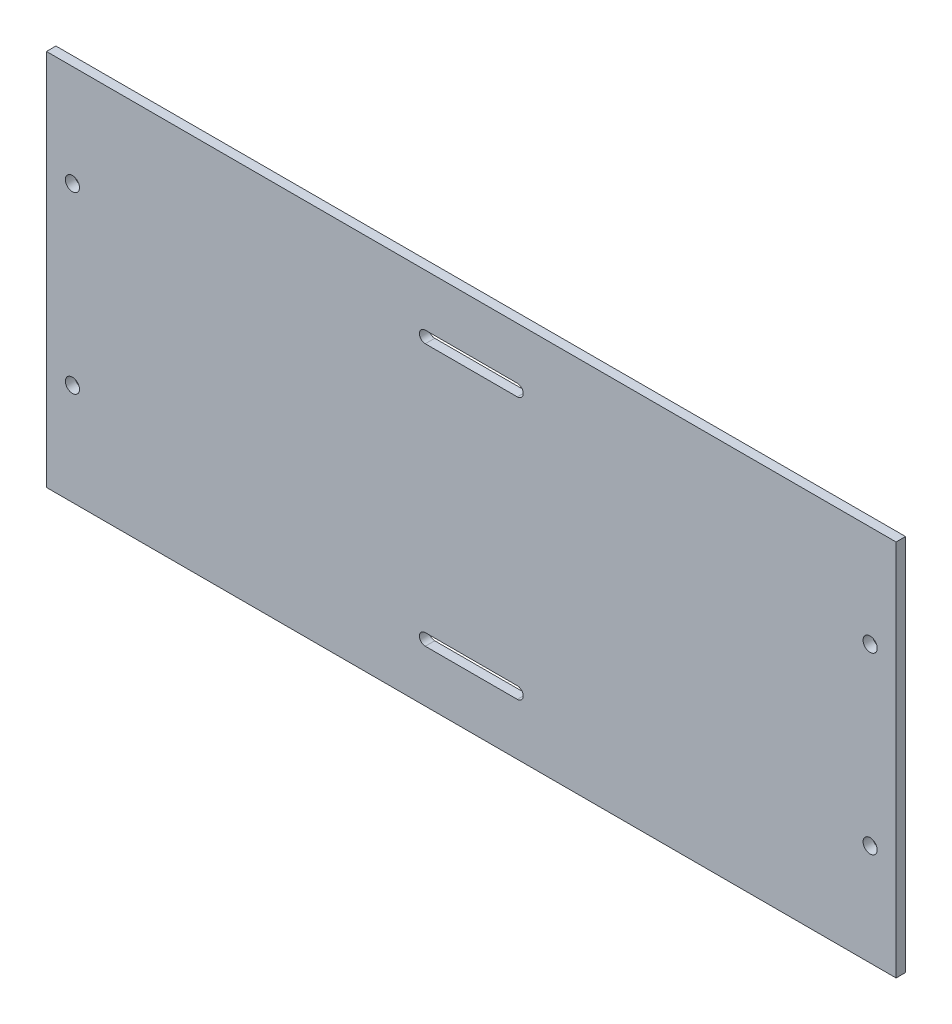
ISO-10303-21;
HEADER;
FILE_DESCRIPTION(('STEP AP214'),'2;1');
FILE_NAME('part.step','',(''),(''),'','','');
FILE_SCHEMA(('AUTOMOTIVE_DESIGN { 1 0 10303 214 1 1 1 1 }'));
ENDSEC;
DATA;
#1=APPLICATION_CONTEXT('core data for automotive mechanical design processes');
#2=APPLICATION_PROTOCOL_DEFINITION('international standard','automotive_design',2000,#1);
#3=PRODUCT_CONTEXT('',#1,'mechanical');
#4=PRODUCT('Part','Part','',(#3));
#5=PRODUCT_RELATED_PRODUCT_CATEGORY('part','',(#4));
#6=PRODUCT_DEFINITION_FORMATION('','',#4);
#7=PRODUCT_DEFINITION_CONTEXT('part definition',#1,'design');
#8=PRODUCT_DEFINITION('design','',#6,#7);
#9=PRODUCT_DEFINITION_SHAPE('','',#8);
#10=(LENGTH_UNIT() NAMED_UNIT(*) SI_UNIT(.MILLI.,.METRE.));
#11=(NAMED_UNIT(*) PLANE_ANGLE_UNIT() SI_UNIT($,.RADIAN.));
#12=(NAMED_UNIT(*) SI_UNIT($,.STERADIAN.) SOLID_ANGLE_UNIT());
#13=UNCERTAINTY_MEASURE_WITH_UNIT(LENGTH_MEASURE(1.E-05),#10,'distance_accuracy_value','');
#14=(GEOMETRIC_REPRESENTATION_CONTEXT(3) GLOBAL_UNCERTAINTY_ASSIGNED_CONTEXT((#13)) GLOBAL_UNIT_ASSIGNED_CONTEXT((#10,
#11,#12)) REPRESENTATION_CONTEXT('',''));
#15=CARTESIAN_POINT('',(0.,0.,0.));
#16=DIRECTION('',(0.,0.,1.));
#17=DIRECTION('',(1.,0.,0.));
#18=AXIS2_PLACEMENT_3D('',#15,#16,#17);
#19=CARTESIAN_POINT('',(99.75,-67.75,0.));
#20=DIRECTION('',(0.,0.,-1.));
#21=DIRECTION('',(-1.,0.,0.));
#22=AXIS2_PLACEMENT_3D('',#19,#20,#21);
#23=CYLINDRICAL_SURFACE('',#22,1.25);
#24=DIRECTION('',(0.,0.,1.));
#25=VECTOR('',#24,1.);
#26=CARTESIAN_POINT('',(99.75,-66.5,0.));
#27=LINE('',#26,#25);
#28=CARTESIAN_POINT('',(99.75,-66.5,0.));
#29=VERTEX_POINT('',#28);
#30=CARTESIAN_POINT('',(99.75,-66.5,2.));
#31=VERTEX_POINT('',#30);
#32=EDGE_CURVE('E213',#29,#31,#27,.T.);
#33=ORIENTED_EDGE('',*,*,#32,.F.);
#34=CARTESIAN_POINT('',(99.75,-67.75,0.));
#35=DIRECTION('',(0.,0.,1.));
#36=DIRECTION('',(1.,0.,0.));
#37=AXIS2_PLACEMENT_3D('',#34,#35,#36);
#38=CIRCLE('',#37,1.25);
#39=CARTESIAN_POINT('',(99.75,-69.,0.));
#40=VERTEX_POINT('',#39);
#41=EDGE_CURVE('E57',#29,#40,#38,.F.);
#42=ORIENTED_EDGE('',*,*,#41,.T.);
#43=DIRECTION('',(0.,0.,1.));
#44=VECTOR('',#43,1.);
#45=CARTESIAN_POINT('',(99.75,-69.,0.));
#46=LINE('',#45,#44);
#47=CARTESIAN_POINT('',(99.75,-69.,2.));
#48=VERTEX_POINT('',#47);
#49=EDGE_CURVE('E220',#48,#40,#46,.F.);
#50=ORIENTED_EDGE('',*,*,#49,.F.);
#51=CARTESIAN_POINT('',(99.75,-67.75,2.));
#52=DIRECTION('',(0.,0.,1.));
#53=DIRECTION('',(1.,0.,0.));
#54=AXIS2_PLACEMENT_3D('',#51,#52,#53);
#55=CIRCLE('',#54,1.25);
#56=EDGE_CURVE('E11',#48,#31,#55,.T.);
#57=ORIENTED_EDGE('',*,*,#56,.T.);
#58=EDGE_LOOP('',(#33,#42,#50,#57));
#59=FACE_BOUND('',#58,.T.);
#60=ADVANCED_FACE('F50',(#59),#23,.F.);
#61=CARTESIAN_POINT('',(80.25,-67.75,2.));
#62=DIRECTION('',(0.,0.,-1.));
#63=DIRECTION('',(-1.,0.,0.));
#64=AXIS2_PLACEMENT_3D('',#61,#62,#63);
#65=CYLINDRICAL_SURFACE('',#64,1.25);
#66=DIRECTION('',(0.,0.,1.));
#67=VECTOR('',#66,1.);
#68=CARTESIAN_POINT('',(80.25,-66.5,2.));
#69=LINE('',#68,#67);
#70=CARTESIAN_POINT('',(80.25,-66.5,2.));
#71=VERTEX_POINT('',#70);
#72=CARTESIAN_POINT('',(80.25,-66.5,0.));
#73=VERTEX_POINT('',#72);
#74=EDGE_CURVE('E196',#71,#73,#69,.F.);
#75=ORIENTED_EDGE('',*,*,#74,.F.);
#76=CARTESIAN_POINT('',(80.25,-67.75,2.));
#77=DIRECTION('',(0.,0.,1.));
#78=DIRECTION('',(1.,0.,0.));
#79=AXIS2_PLACEMENT_3D('',#76,#77,#78);
#80=CIRCLE('',#79,1.25);
#81=CARTESIAN_POINT('',(80.25,-69.,2.));
#82=VERTEX_POINT('',#81);
#83=EDGE_CURVE('E206',#71,#82,#80,.T.);
#84=ORIENTED_EDGE('',*,*,#83,.T.);
#85=DIRECTION('',(0.,0.,1.));
#86=VECTOR('',#85,1.);
#87=CARTESIAN_POINT('',(80.25,-69.,2.));
#88=LINE('',#87,#86);
#89=CARTESIAN_POINT('',(80.25,-69.,0.));
#90=VERTEX_POINT('',#89);
#91=EDGE_CURVE('E205',#90,#82,#88,.T.);
#92=ORIENTED_EDGE('',*,*,#91,.F.);
#93=CARTESIAN_POINT('',(80.25,-67.75,0.));
#94=DIRECTION('',(0.,0.,1.));
#95=DIRECTION('',(1.,0.,0.));
#96=AXIS2_PLACEMENT_3D('',#93,#94,#95);
#97=CIRCLE('',#96,1.25);
#98=EDGE_CURVE('E207',#90,#73,#97,.F.);
#99=ORIENTED_EDGE('',*,*,#98,.T.);
#100=EDGE_LOOP('',(#75,#84,#92,#99));
#101=FACE_BOUND('',#100,.T.);
#102=ADVANCED_FACE('F320',(#101),#65,.F.);
#103=CARTESIAN_POINT('',(99.75,-12.25,0.));
#104=DIRECTION('',(0.,0.,-1.));
#105=DIRECTION('',(-1.,0.,0.));
#106=AXIS2_PLACEMENT_3D('',#103,#104,#105);
#107=CYLINDRICAL_SURFACE('',#106,1.25);
#108=DIRECTION('',(0.,0.,1.));
#109=VECTOR('',#108,1.);
#110=CARTESIAN_POINT('',(99.75,-11.,0.));
#111=LINE('',#110,#109);
#112=CARTESIAN_POINT('',(99.75,-11.,0.));
#113=VERTEX_POINT('',#112);
#114=CARTESIAN_POINT('',(99.75,-11.,2.));
#115=VERTEX_POINT('',#114);
#116=EDGE_CURVE('E184',#113,#115,#111,.T.);
#117=ORIENTED_EDGE('',*,*,#116,.F.);
#118=CARTESIAN_POINT('',(99.75,-12.25,0.));
#119=DIRECTION('',(0.,0.,1.));
#120=DIRECTION('',(1.,0.,0.));
#121=AXIS2_PLACEMENT_3D('',#118,#119,#120);
#122=CIRCLE('',#121,1.25);
#123=CARTESIAN_POINT('',(99.75,-13.5,0.));
#124=VERTEX_POINT('',#123);
#125=EDGE_CURVE('E194',#113,#124,#122,.F.);
#126=ORIENTED_EDGE('',*,*,#125,.T.);
#127=DIRECTION('',(0.,0.,1.));
#128=VECTOR('',#127,1.);
#129=CARTESIAN_POINT('',(99.75,-13.5,0.));
#130=LINE('',#129,#128);
#131=CARTESIAN_POINT('',(99.75,-13.5,2.));
#132=VERTEX_POINT('',#131);
#133=EDGE_CURVE('E187',#132,#124,#130,.F.);
#134=ORIENTED_EDGE('',*,*,#133,.F.);
#135=CARTESIAN_POINT('',(99.75,-12.25,2.));
#136=DIRECTION('',(0.,0.,1.));
#137=DIRECTION('',(1.,0.,0.));
#138=AXIS2_PLACEMENT_3D('',#135,#136,#137);
#139=CIRCLE('',#138,1.25);
#140=EDGE_CURVE('E193',#132,#115,#139,.T.);
#141=ORIENTED_EDGE('',*,*,#140,.T.);
#142=EDGE_LOOP('',(#117,#126,#134,#141));
#143=FACE_BOUND('',#142,.T.);
#144=ADVANCED_FACE('F325',(#143),#107,.F.);
#145=CARTESIAN_POINT('',(80.25,-12.25,2.));
#146=DIRECTION('',(0.,0.,-1.));
#147=DIRECTION('',(-1.,0.,0.));
#148=AXIS2_PLACEMENT_3D('',#145,#146,#147);
#149=CYLINDRICAL_SURFACE('',#148,1.25000000000001);
#150=DIRECTION('',(0.,0.,1.));
#151=VECTOR('',#150,1.);
#152=CARTESIAN_POINT('',(80.25,-11.,2.));
#153=LINE('',#152,#151);
#154=CARTESIAN_POINT('',(80.25,-11.,2.));
#155=VERTEX_POINT('',#154);
#156=CARTESIAN_POINT('',(80.25,-11.,0.));
#157=VERTEX_POINT('',#156);
#158=EDGE_CURVE('E162',#155,#157,#153,.F.);
#159=ORIENTED_EDGE('',*,*,#158,.F.);
#160=CARTESIAN_POINT('',(80.25,-12.25,2.));
#161=DIRECTION('',(0.,0.,1.));
#162=DIRECTION('',(1.,0.,0.));
#163=AXIS2_PLACEMENT_3D('',#160,#161,#162);
#164=CIRCLE('',#163,1.25000000000001);
#165=CARTESIAN_POINT('',(80.25,-13.5,2.));
#166=VERTEX_POINT('',#165);
#167=EDGE_CURVE('E179',#155,#166,#164,.T.);
#168=ORIENTED_EDGE('',*,*,#167,.T.);
#169=DIRECTION('',(0.,0.,1.));
#170=VECTOR('',#169,1.);
#171=CARTESIAN_POINT('',(80.25,-13.5,2.));
#172=LINE('',#171,#170);
#173=CARTESIAN_POINT('',(80.25,-13.5,0.));
#174=VERTEX_POINT('',#173);
#175=EDGE_CURVE('E169',#174,#166,#172,.T.);
#176=ORIENTED_EDGE('',*,*,#175,.F.);
#177=CARTESIAN_POINT('',(80.25,-12.25,0.));
#178=DIRECTION('',(0.,0.,1.));
#179=DIRECTION('',(1.,0.,0.));
#180=AXIS2_PLACEMENT_3D('',#177,#178,#179);
#181=CIRCLE('',#180,1.25000000000001);
#182=EDGE_CURVE('E178',#174,#157,#181,.F.);
#183=ORIENTED_EDGE('',*,*,#182,.T.);
#184=EDGE_LOOP('',(#159,#168,#176,#183));
#185=FACE_BOUND('',#184,.T.);
#186=ADVANCED_FACE('F329',(#185),#149,.F.);
#187=CARTESIAN_POINT('',(0.,0.,2.));
#188=DIRECTION('',(0.,0.,1.));
#189=DIRECTION('',(1.,0.,0.));
#190=AXIS2_PLACEMENT_3D('',#187,#188,#189);
#191=PLANE('',#190);
#192=CARTESIAN_POINT('',(174.5,-58.5,2.));
#193=DIRECTION('',(0.,0.,1.));
#194=DIRECTION('',(1.,0.,0.));
#195=AXIS2_PLACEMENT_3D('',#192,#193,#194);
#196=CIRCLE('',#195,1.5);
#197=CARTESIAN_POINT('',(176.,-58.5,2.));
#198=VERTEX_POINT('',#197);
#199=EDGE_CURVE('E264',#198,#198,#196,.T.);
#200=ORIENTED_EDGE('',*,*,#199,.F.);
#201=EDGE_LOOP('',(#200));
#202=FACE_BOUND('',#201,.T.);
#203=CARTESIAN_POINT('',(174.5,-21.5,2.));
#204=DIRECTION('',(0.,0.,1.));
#205=DIRECTION('',(1.,0.,0.));
#206=AXIS2_PLACEMENT_3D('',#203,#204,#205);
#207=CIRCLE('',#206,1.5);
#208=CARTESIAN_POINT('',(176.,-21.5,2.));
#209=VERTEX_POINT('',#208);
#210=EDGE_CURVE('E260',#209,#209,#207,.T.);
#211=ORIENTED_EDGE('',*,*,#210,.F.);
#212=EDGE_LOOP('',(#211));
#213=FACE_BOUND('',#212,.T.);
#214=CARTESIAN_POINT('',(5.50000000000001,-21.5,2.));
#215=DIRECTION('',(0.,0.,1.));
#216=DIRECTION('',(1.,0.,0.));
#217=AXIS2_PLACEMENT_3D('',#214,#215,#216);
#218=CIRCLE('',#217,1.5);
#219=CARTESIAN_POINT('',(7.00000000000001,-21.5,2.));
#220=VERTEX_POINT('',#219);
#221=EDGE_CURVE('E250',#220,#220,#218,.T.);
#222=ORIENTED_EDGE('',*,*,#221,.F.);
#223=EDGE_LOOP('',(#222));
#224=FACE_BOUND('',#223,.T.);
#225=CARTESIAN_POINT('',(5.50000000000001,-58.5,2.));
#226=DIRECTION('',(0.,0.,1.));
#227=DIRECTION('',(1.,0.,0.));
#228=AXIS2_PLACEMENT_3D('',#225,#226,#227);
#229=CIRCLE('',#228,1.5);
#230=CARTESIAN_POINT('',(7.00000000000001,-58.5,2.));
#231=VERTEX_POINT('',#230);
#232=EDGE_CURVE('E252',#231,#231,#229,.T.);
#233=ORIENTED_EDGE('',*,*,#232,.F.);
#234=EDGE_LOOP('',(#233));
#235=FACE_BOUND('',#234,.T.);
#236=DIRECTION('',(0.,-1.,0.));
#237=VECTOR('',#236,1.);
#238=CARTESIAN_POINT('',(0.,0.,2.));
#239=LINE('',#238,#237);
#240=CARTESIAN_POINT('',(0.,0.,2.));
#241=VERTEX_POINT('',#240);
#242=CARTESIAN_POINT('',(0.,-80.,2.));
#243=VERTEX_POINT('',#242);
#244=EDGE_CURVE('E150',#241,#243,#239,.T.);
#245=ORIENTED_EDGE('',*,*,#244,.T.);
#246=DIRECTION('',(1.,0.,0.));
#247=VECTOR('',#246,1.);
#248=CARTESIAN_POINT('',(0.,-80.,2.));
#249=LINE('',#248,#247);
#250=CARTESIAN_POINT('',(180.,-80.,2.));
#251=VERTEX_POINT('',#250);
#252=EDGE_CURVE('E131',#243,#251,#249,.T.);
#253=ORIENTED_EDGE('',*,*,#252,.T.);
#254=DIRECTION('',(0.,1.,0.));
#255=VECTOR('',#254,1.);
#256=CARTESIAN_POINT('',(180.,0.,2.));
#257=LINE('',#256,#255);
#258=CARTESIAN_POINT('',(180.,0.,2.));
#259=VERTEX_POINT('',#258);
#260=EDGE_CURVE('E148',#251,#259,#257,.T.);
#261=ORIENTED_EDGE('',*,*,#260,.T.);
#262=DIRECTION('',(-1.,0.,0.));
#263=VECTOR('',#262,1.);
#264=CARTESIAN_POINT('',(0.,0.,2.));
#265=LINE('',#264,#263);
#266=EDGE_CURVE('E155',#259,#241,#265,.T.);
#267=ORIENTED_EDGE('',*,*,#266,.T.);
#268=EDGE_LOOP('',(#245,#253,#261,#267));
#269=FACE_BOUND('',#268,.T.);
#270=DIRECTION('',(1.,0.,0.));
#271=VECTOR('',#270,1.);
#272=CARTESIAN_POINT('',(79.,-69.,2.));
#273=LINE('',#272,#271);
#274=EDGE_CURVE('E228',#82,#48,#273,.T.);
#275=ORIENTED_EDGE('',*,*,#274,.F.);
#276=ORIENTED_EDGE('',*,*,#83,.F.);
#277=DIRECTION('',(-1.,0.,0.));
#278=VECTOR('',#277,1.);
#279=CARTESIAN_POINT('',(79.,-66.5,2.));
#280=LINE('',#279,#278);
#281=EDGE_CURVE('E242',#31,#71,#280,.T.);
#282=ORIENTED_EDGE('',*,*,#281,.F.);
#283=ORIENTED_EDGE('',*,*,#56,.F.);
#284=EDGE_LOOP('',(#275,#276,#282,#283));
#285=FACE_BOUND('',#284,.T.);
#286=DIRECTION('',(1.,0.,0.));
#287=VECTOR('',#286,1.);
#288=CARTESIAN_POINT('',(79.,-13.5,2.));
#289=LINE('',#288,#287);
#290=EDGE_CURVE('E338',#166,#132,#289,.T.);
#291=ORIENTED_EDGE('',*,*,#290,.F.);
#292=ORIENTED_EDGE('',*,*,#167,.F.);
#293=DIRECTION('',(-1.,0.,0.));
#294=VECTOR('',#293,1.);
#295=CARTESIAN_POINT('',(79.,-11.,2.));
#296=LINE('',#295,#294);
#297=EDGE_CURVE('E272',#115,#155,#296,.T.);
#298=ORIENTED_EDGE('',*,*,#297,.F.);
#299=ORIENTED_EDGE('',*,*,#140,.F.);
#300=EDGE_LOOP('',(#291,#292,#298,#299));
#301=FACE_BOUND('',#300,.T.);
#302=ADVANCED_FACE('F147',(#202,#213,#224,#235,#269,#285,#301),#191,.T.);
#303=CARTESIAN_POINT('',(0.,0.,0.));
#304=DIRECTION('',(0.,0.,1.));
#305=DIRECTION('',(1.,0.,0.));
#306=AXIS2_PLACEMENT_3D('',#303,#304,#305);
#307=PLANE('',#306);
#308=ORIENTED_EDGE('',*,*,#41,.F.);
#309=DIRECTION('',(-1.,0.,0.));
#310=VECTOR('',#309,1.);
#311=CARTESIAN_POINT('',(79.,-66.5,0.));
#312=LINE('',#311,#310);
#313=EDGE_CURVE('E235',#29,#73,#312,.T.);
#314=ORIENTED_EDGE('',*,*,#313,.T.);
#315=ORIENTED_EDGE('',*,*,#98,.F.);
#316=DIRECTION('',(1.,0.,0.));
#317=VECTOR('',#316,1.);
#318=CARTESIAN_POINT('',(79.,-69.,0.));
#319=LINE('',#318,#317);
#320=EDGE_CURVE('E223',#90,#40,#319,.T.);
#321=ORIENTED_EDGE('',*,*,#320,.T.);
#322=EDGE_LOOP('',(#308,#314,#315,#321));
#323=FACE_BOUND('',#322,.T.);
#324=ORIENTED_EDGE('',*,*,#125,.F.);
#325=DIRECTION('',(-1.,0.,0.));
#326=VECTOR('',#325,1.);
#327=CARTESIAN_POINT('',(79.,-11.,0.));
#328=LINE('',#327,#326);
#329=EDGE_CURVE('E236',#113,#157,#328,.T.);
#330=ORIENTED_EDGE('',*,*,#329,.T.);
#331=ORIENTED_EDGE('',*,*,#182,.F.);
#332=DIRECTION('',(1.,0.,0.));
#333=VECTOR('',#332,1.);
#334=CARTESIAN_POINT('',(79.,-13.5,0.));
#335=LINE('',#334,#333);
#336=EDGE_CURVE('E234',#174,#124,#335,.T.);
#337=ORIENTED_EDGE('',*,*,#336,.T.);
#338=EDGE_LOOP('',(#324,#330,#331,#337));
#339=FACE_BOUND('',#338,.T.);
#340=CARTESIAN_POINT('',(174.5,-58.5,0.));
#341=DIRECTION('',(0.,0.,1.));
#342=DIRECTION('',(1.,0.,0.));
#343=AXIS2_PLACEMENT_3D('',#340,#341,#342);
#344=CIRCLE('',#343,1.5);
#345=CARTESIAN_POINT('',(176.,-58.5,0.));
#346=VERTEX_POINT('',#345);
#347=EDGE_CURVE('E267',#346,#346,#344,.T.);
#348=ORIENTED_EDGE('',*,*,#347,.T.);
#349=EDGE_LOOP('',(#348));
#350=FACE_BOUND('',#349,.T.);
#351=CARTESIAN_POINT('',(174.5,-21.5,0.));
#352=DIRECTION('',(0.,0.,1.));
#353=DIRECTION('',(1.,0.,0.));
#354=AXIS2_PLACEMENT_3D('',#351,#352,#353);
#355=CIRCLE('',#354,1.5);
#356=CARTESIAN_POINT('',(176.,-21.5,0.));
#357=VERTEX_POINT('',#356);
#358=EDGE_CURVE('E261',#357,#357,#355,.T.);
#359=ORIENTED_EDGE('',*,*,#358,.T.);
#360=EDGE_LOOP('',(#359));
#361=FACE_BOUND('',#360,.T.);
#362=CARTESIAN_POINT('',(5.50000000000001,-21.5,0.));
#363=DIRECTION('',(0.,0.,1.));
#364=DIRECTION('',(1.,0.,0.));
#365=AXIS2_PLACEMENT_3D('',#362,#363,#364);
#366=CIRCLE('',#365,1.5);
#367=CARTESIAN_POINT('',(7.00000000000001,-21.5,0.));
#368=VERTEX_POINT('',#367);
#369=EDGE_CURVE('E251',#368,#368,#366,.T.);
#370=ORIENTED_EDGE('',*,*,#369,.T.);
#371=EDGE_LOOP('',(#370));
#372=FACE_BOUND('',#371,.T.);
#373=CARTESIAN_POINT('',(5.50000000000001,-58.5,0.));
#374=DIRECTION('',(0.,0.,1.));
#375=DIRECTION('',(1.,0.,0.));
#376=AXIS2_PLACEMENT_3D('',#373,#374,#375);
#377=CIRCLE('',#376,1.5);
#378=CARTESIAN_POINT('',(7.00000000000001,-58.5,0.));
#379=VERTEX_POINT('',#378);
#380=EDGE_CURVE('E273',#379,#379,#377,.T.);
#381=ORIENTED_EDGE('',*,*,#380,.T.);
#382=EDGE_LOOP('',(#381));
#383=FACE_BOUND('',#382,.T.);
#384=DIRECTION('',(0.,-1.,0.));
#385=VECTOR('',#384,1.);
#386=CARTESIAN_POINT('',(0.,0.,0.));
#387=LINE('',#386,#385);
#388=CARTESIAN_POINT('',(0.,0.,0.));
#389=VERTEX_POINT('',#388);
#390=CARTESIAN_POINT('',(0.,-80.,0.));
#391=VERTEX_POINT('',#390);
#392=EDGE_CURVE('E161',#389,#391,#387,.T.);
#393=ORIENTED_EDGE('',*,*,#392,.F.);
#394=DIRECTION('',(-1.,0.,0.));
#395=VECTOR('',#394,1.);
#396=CARTESIAN_POINT('',(0.,0.,0.));
#397=LINE('',#396,#395);
#398=CARTESIAN_POINT('',(180.,0.,0.));
#399=VERTEX_POINT('',#398);
#400=EDGE_CURVE('E160',#399,#389,#397,.T.);
#401=ORIENTED_EDGE('',*,*,#400,.F.);
#402=DIRECTION('',(0.,1.,0.));
#403=VECTOR('',#402,1.);
#404=CARTESIAN_POINT('',(180.,0.,0.));
#405=LINE('',#404,#403);
#406=CARTESIAN_POINT('',(180.,-80.,0.));
#407=VERTEX_POINT('',#406);
#408=EDGE_CURVE('E292',#407,#399,#405,.T.);
#409=ORIENTED_EDGE('',*,*,#408,.F.);
#410=DIRECTION('',(1.,0.,0.));
#411=VECTOR('',#410,1.);
#412=CARTESIAN_POINT('',(0.,-80.,0.));
#413=LINE('',#412,#411);
#414=EDGE_CURVE('E290',#391,#407,#413,.T.);
#415=ORIENTED_EDGE('',*,*,#414,.F.);
#416=EDGE_LOOP('',(#393,#401,#409,#415));
#417=FACE_BOUND('',#416,.T.);
#418=ADVANCED_FACE('F227',(#323,#339,#350,#361,#372,#383,#417),#307,.F.);
#419=CARTESIAN_POINT('',(0.,0.,2.));
#420=DIRECTION('',(1.,0.,0.));
#421=DIRECTION('',(0.,0.,-1.));
#422=AXIS2_PLACEMENT_3D('',#419,#420,#421);
#423=PLANE('',#422);
#424=ORIENTED_EDGE('',*,*,#392,.T.);
#425=DIRECTION('',(0.,0.,-1.));
#426=VECTOR('',#425,1.);
#427=CARTESIAN_POINT('',(0.,-80.,2.));
#428=LINE('',#427,#426);
#429=EDGE_CURVE('E136',#243,#391,#428,.T.);
#430=ORIENTED_EDGE('',*,*,#429,.F.);
#431=ORIENTED_EDGE('',*,*,#244,.F.);
#432=DIRECTION('',(0.,0.,-1.));
#433=VECTOR('',#432,1.);
#434=CARTESIAN_POINT('',(0.,0.,2.));
#435=LINE('',#434,#433);
#436=EDGE_CURVE('E281',#241,#389,#435,.T.);
#437=ORIENTED_EDGE('',*,*,#436,.T.);
#438=EDGE_LOOP('',(#424,#430,#431,#437));
#439=FACE_BOUND('',#438,.T.);
#440=ADVANCED_FACE('F157',(#439),#423,.F.);
#441=CARTESIAN_POINT('',(0.,-80.,2.));
#442=DIRECTION('',(0.,1.,0.));
#443=DIRECTION('',(0.,0.,1.));
#444=AXIS2_PLACEMENT_3D('',#441,#442,#443);
#445=PLANE('',#444);
#446=ORIENTED_EDGE('',*,*,#414,.T.);
#447=DIRECTION('',(0.,0.,-1.));
#448=VECTOR('',#447,1.);
#449=CARTESIAN_POINT('',(180.,-80.,2.));
#450=LINE('',#449,#448);
#451=EDGE_CURVE('E142',#251,#407,#450,.T.);
#452=ORIENTED_EDGE('',*,*,#451,.F.);
#453=ORIENTED_EDGE('',*,*,#252,.F.);
#454=ORIENTED_EDGE('',*,*,#429,.T.);
#455=EDGE_LOOP('',(#446,#452,#453,#454));
#456=FACE_BOUND('',#455,.T.);
#457=ADVANCED_FACE('F139',(#456),#445,.F.);
#458=CARTESIAN_POINT('',(180.,0.,2.));
#459=DIRECTION('',(-1.,0.,0.));
#460=DIRECTION('',(0.,0.,1.));
#461=AXIS2_PLACEMENT_3D('',#458,#459,#460);
#462=PLANE('',#461);
#463=ORIENTED_EDGE('',*,*,#408,.T.);
#464=DIRECTION('',(0.,0.,-1.));
#465=VECTOR('',#464,1.);
#466=CARTESIAN_POINT('',(180.,0.,2.));
#467=LINE('',#466,#465);
#468=EDGE_CURVE('E168',#259,#399,#467,.T.);
#469=ORIENTED_EDGE('',*,*,#468,.F.);
#470=ORIENTED_EDGE('',*,*,#260,.F.);
#471=ORIENTED_EDGE('',*,*,#451,.T.);
#472=EDGE_LOOP('',(#463,#469,#470,#471));
#473=FACE_BOUND('',#472,.T.);
#474=ADVANCED_FACE('F308',(#473),#462,.F.);
#475=CARTESIAN_POINT('',(0.,0.,2.));
#476=DIRECTION('',(0.,-1.,0.));
#477=DIRECTION('',(0.,0.,-1.));
#478=AXIS2_PLACEMENT_3D('',#475,#476,#477);
#479=PLANE('',#478);
#480=ORIENTED_EDGE('',*,*,#400,.T.);
#481=ORIENTED_EDGE('',*,*,#436,.F.);
#482=ORIENTED_EDGE('',*,*,#266,.F.);
#483=ORIENTED_EDGE('',*,*,#468,.T.);
#484=EDGE_LOOP('',(#480,#481,#482,#483));
#485=FACE_BOUND('',#484,.T.);
#486=ADVANCED_FACE('F304',(#485),#479,.F.);
#487=CARTESIAN_POINT('',(5.50000000000001,-58.5,0.));
#488=DIRECTION('',(0.,0.,1.));
#489=DIRECTION('',(1.,0.,0.));
#490=AXIS2_PLACEMENT_3D('',#487,#488,#489);
#491=CYLINDRICAL_SURFACE('',#490,1.5);
#492=ORIENTED_EDGE('',*,*,#380,.F.);
#493=EDGE_LOOP('',(#492));
#494=FACE_BOUND('',#493,.T.);
#495=ORIENTED_EDGE('',*,*,#232,.T.);
#496=EDGE_LOOP('',(#495));
#497=FACE_BOUND('',#496,.T.);
#498=ADVANCED_FACE('F311',(#494,#497),#491,.F.);
#499=CARTESIAN_POINT('',(5.50000000000001,-21.5,0.));
#500=DIRECTION('',(0.,0.,1.));
#501=DIRECTION('',(1.,0.,0.));
#502=AXIS2_PLACEMENT_3D('',#499,#500,#501);
#503=CYLINDRICAL_SURFACE('',#502,1.5);
#504=ORIENTED_EDGE('',*,*,#369,.F.);
#505=EDGE_LOOP('',(#504));
#506=FACE_BOUND('',#505,.T.);
#507=ORIENTED_EDGE('',*,*,#221,.T.);
#508=EDGE_LOOP('',(#507));
#509=FACE_BOUND('',#508,.T.);
#510=ADVANCED_FACE('F369',(#506,#509),#503,.F.);
#511=CARTESIAN_POINT('',(174.5,-21.5,0.));
#512=DIRECTION('',(0.,0.,1.));
#513=DIRECTION('',(1.,0.,0.));
#514=AXIS2_PLACEMENT_3D('',#511,#512,#513);
#515=CYLINDRICAL_SURFACE('',#514,1.5);
#516=ORIENTED_EDGE('',*,*,#358,.F.);
#517=EDGE_LOOP('',(#516));
#518=FACE_BOUND('',#517,.T.);
#519=ORIENTED_EDGE('',*,*,#210,.T.);
#520=EDGE_LOOP('',(#519));
#521=FACE_BOUND('',#520,.T.);
#522=ADVANCED_FACE('F375',(#518,#521),#515,.F.);
#523=CARTESIAN_POINT('',(174.5,-58.5,0.));
#524=DIRECTION('',(0.,0.,1.));
#525=DIRECTION('',(1.,0.,0.));
#526=AXIS2_PLACEMENT_3D('',#523,#524,#525);
#527=CYLINDRICAL_SURFACE('',#526,1.5);
#528=ORIENTED_EDGE('',*,*,#347,.F.);
#529=EDGE_LOOP('',(#528));
#530=FACE_BOUND('',#529,.T.);
#531=ORIENTED_EDGE('',*,*,#199,.T.);
#532=EDGE_LOOP('',(#531));
#533=FACE_BOUND('',#532,.T.);
#534=ADVANCED_FACE('F370',(#530,#533),#527,.F.);
#535=CARTESIAN_POINT('',(79.,-69.,2.));
#536=DIRECTION('',(0.,1.,0.));
#537=DIRECTION('',(0.,0.,1.));
#538=AXIS2_PLACEMENT_3D('',#535,#536,#537);
#539=PLANE('',#538);
#540=ORIENTED_EDGE('',*,*,#274,.T.);
#541=ORIENTED_EDGE('',*,*,#49,.T.);
#542=ORIENTED_EDGE('',*,*,#320,.F.);
#543=ORIENTED_EDGE('',*,*,#91,.T.);
#544=EDGE_LOOP('',(#540,#541,#542,#543));
#545=FACE_BOUND('',#544,.T.);
#546=ADVANCED_FACE('F221',(#545),#539,.T.);
#547=CARTESIAN_POINT('',(79.,-66.5,2.));
#548=DIRECTION('',(0.,-1.,0.));
#549=DIRECTION('',(0.,0.,-1.));
#550=AXIS2_PLACEMENT_3D('',#547,#548,#549);
#551=PLANE('',#550);
#552=ORIENTED_EDGE('',*,*,#313,.F.);
#553=ORIENTED_EDGE('',*,*,#32,.T.);
#554=ORIENTED_EDGE('',*,*,#281,.T.);
#555=ORIENTED_EDGE('',*,*,#74,.T.);
#556=EDGE_LOOP('',(#552,#553,#554,#555));
#557=FACE_BOUND('',#556,.T.);
#558=ADVANCED_FACE('F326',(#557),#551,.T.);
#559=CARTESIAN_POINT('',(79.,-13.5,2.));
#560=DIRECTION('',(0.,1.,0.));
#561=DIRECTION('',(-1.,0.,0.));
#562=AXIS2_PLACEMENT_3D('',#559,#560,#561);
#563=PLANE('',#562);
#564=ORIENTED_EDGE('',*,*,#290,.T.);
#565=ORIENTED_EDGE('',*,*,#133,.T.);
#566=ORIENTED_EDGE('',*,*,#336,.F.);
#567=ORIENTED_EDGE('',*,*,#175,.T.);
#568=EDGE_LOOP('',(#564,#565,#566,#567));
#569=FACE_BOUND('',#568,.T.);
#570=ADVANCED_FACE('F351',(#569),#563,.T.);
#571=CARTESIAN_POINT('',(79.,-11.,2.));
#572=DIRECTION('',(0.,-1.,0.));
#573=DIRECTION('',(1.,0.,0.));
#574=AXIS2_PLACEMENT_3D('',#571,#572,#573);
#575=PLANE('',#574);
#576=ORIENTED_EDGE('',*,*,#329,.F.);
#577=ORIENTED_EDGE('',*,*,#116,.T.);
#578=ORIENTED_EDGE('',*,*,#297,.T.);
#579=ORIENTED_EDGE('',*,*,#158,.T.);
#580=EDGE_LOOP('',(#576,#577,#578,#579));
#581=FACE_BOUND('',#580,.T.);
#582=ADVANCED_FACE('F352',(#581),#575,.T.);
#583=CLOSED_SHELL('',(#60,#102,#144,#186,#302,#418,#440,#457,#474,#486,#498,#510,#522,#534,#546,
#558,#570,#582));
#584=MANIFOLD_SOLID_BREP('B2',#583);
#585=ADVANCED_BREP_SHAPE_REPRESENTATION('',(#18,#584),#14);
#586=SHAPE_DEFINITION_REPRESENTATION(#9,#585);
ENDSEC;
END-ISO-10303-21;
